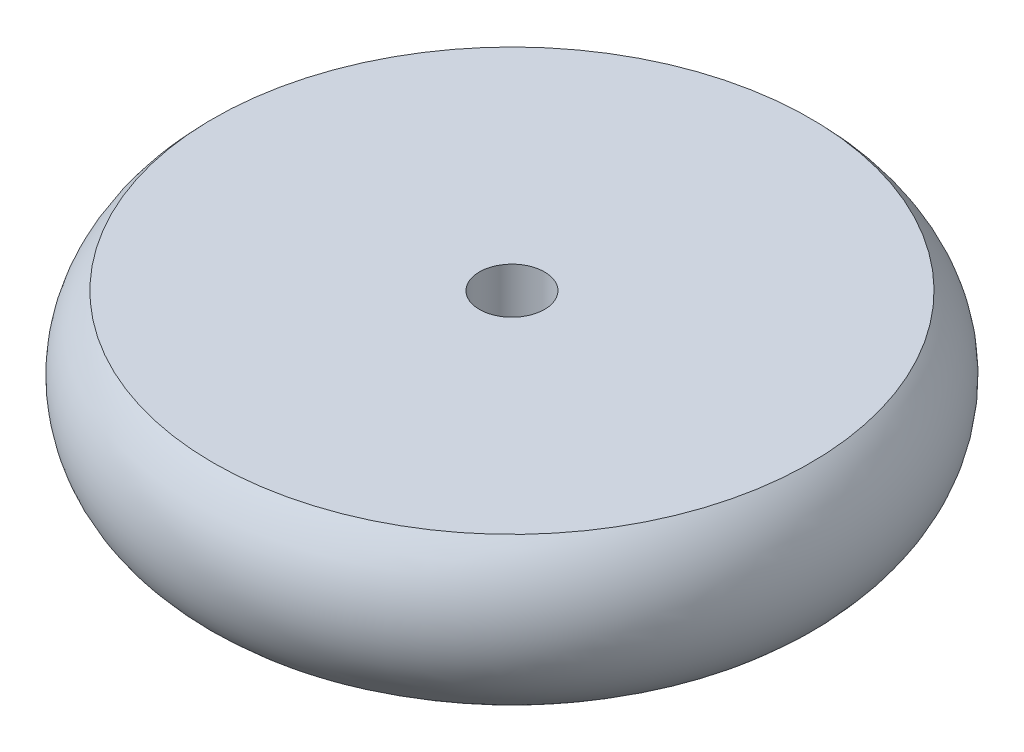
ISO-10303-21;
HEADER;
FILE_DESCRIPTION(('STEP AP214'),'2;1');
FILE_NAME('part.step','',(''),(''),'','','');
FILE_SCHEMA(('AUTOMOTIVE_DESIGN { 1 0 10303 214 1 1 1 1 }'));
ENDSEC;
DATA;
#1=APPLICATION_CONTEXT('core data for automotive mechanical design processes');
#2=APPLICATION_PROTOCOL_DEFINITION('international standard','automotive_design',2000,#1);
#3=PRODUCT_CONTEXT('',#1,'mechanical');
#4=PRODUCT('Part','Part','',(#3));
#5=PRODUCT_RELATED_PRODUCT_CATEGORY('part','',(#4));
#6=PRODUCT_DEFINITION_FORMATION('','',#4);
#7=PRODUCT_DEFINITION_CONTEXT('part definition',#1,'design');
#8=PRODUCT_DEFINITION('design','',#6,#7);
#9=PRODUCT_DEFINITION_SHAPE('','',#8);
#10=(LENGTH_UNIT() NAMED_UNIT(*) SI_UNIT(.MILLI.,.METRE.));
#11=(NAMED_UNIT(*) PLANE_ANGLE_UNIT() SI_UNIT($,.RADIAN.));
#12=(NAMED_UNIT(*) SI_UNIT($,.STERADIAN.) SOLID_ANGLE_UNIT());
#13=UNCERTAINTY_MEASURE_WITH_UNIT(LENGTH_MEASURE(1.E-05),#10,'distance_accuracy_value','');
#14=(GEOMETRIC_REPRESENTATION_CONTEXT(3) GLOBAL_UNCERTAINTY_ASSIGNED_CONTEXT((#13)) GLOBAL_UNIT_ASSIGNED_CONTEXT((#10,
#11,#12)) REPRESENTATION_CONTEXT('',''));
#15=CARTESIAN_POINT('',(0.,0.,0.));
#16=DIRECTION('',(0.,0.,1.));
#17=DIRECTION('',(1.,0.,0.));
#18=AXIS2_PLACEMENT_3D('',#15,#16,#17);
#19=CARTESIAN_POINT('',(8.06045468459707,-12.5,0.));
#20=DIRECTION('',(0.,1.,0.));
#21=DIRECTION('',(0.,0.,1.));
#22=AXIS2_PLACEMENT_3D('',#19,#20,#21);
#23=PLANE('',#22);
#24=CARTESIAN_POINT('',(0.,-12.5,0.));
#25=DIRECTION('',(0.,1.,0.));
#26=DIRECTION('',(0.,0.,1.));
#27=AXIS2_PLACEMENT_3D('',#24,#25,#26);
#28=CIRCLE('',#27,28.);
#29=CARTESIAN_POINT('',(0.,-12.5,28.));
#30=VERTEX_POINT('',#29);
#31=EDGE_CURVE('E10',#30,#30,#28,.T.);
#32=ORIENTED_EDGE('',*,*,#31,.F.);
#33=EDGE_LOOP('',(#32));
#34=FACE_BOUND('',#33,.T.);
#35=CARTESIAN_POINT('',(0.,-12.5,0.));
#36=DIRECTION('',(0.,1.,0.));
#37=DIRECTION('',(0.,0.,1.));
#38=AXIS2_PLACEMENT_3D('',#35,#36,#37);
#39=CIRCLE('',#38,4.);
#40=CARTESIAN_POINT('',(0.,-12.5,4.));
#41=VERTEX_POINT('',#40);
#42=EDGE_CURVE('E48',#41,#41,#39,.T.);
#43=ORIENTED_EDGE('',*,*,#42,.T.);
#44=EDGE_LOOP('',(#43));
#45=FACE_BOUND('',#44,.T.);
#46=ADVANCED_FACE('F34',(#34,#45),#23,.F.);
#47=CARTESIAN_POINT('',(0.,0.,0.));
#48=DIRECTION('',(0.,1.,0.));
#49=DIRECTION('',(0.,0.,1.));
#50=AXIS2_PLACEMENT_3D('',#47,#48,#49);
#51=TOROIDAL_SURFACE('',#50,28.,12.5);
#52=CARTESIAN_POINT('',(0.,8.99999999999999,0.));
#53=DIRECTION('',(0.,1.,0.));
#54=DIRECTION('',(0.,0.,1.));
#55=AXIS2_PLACEMENT_3D('',#52,#53,#54);
#56=CIRCLE('',#55,36.6746757864487);
#57=CARTESIAN_POINT('',(0.,8.99999999999999,36.6746757864487));
#58=VERTEX_POINT('',#57);
#59=EDGE_CURVE('E40',#58,#58,#56,.T.);
#60=ORIENTED_EDGE('',*,*,#59,.F.);
#61=EDGE_LOOP('',(#60));
#62=FACE_BOUND('',#61,.T.);
#63=ORIENTED_EDGE('',*,*,#31,.T.);
#64=EDGE_LOOP('',(#63));
#65=FACE_BOUND('',#64,.T.);
#66=ADVANCED_FACE('F63',(#62,#65),#51,.T.);
#67=CARTESIAN_POINT('',(8.06045468459707,8.99999999999999,0.));
#68=DIRECTION('',(0.,1.,0.));
#69=DIRECTION('',(0.,0.,1.));
#70=AXIS2_PLACEMENT_3D('',#67,#68,#69);
#71=PLANE('',#70);
#72=ORIENTED_EDGE('',*,*,#59,.T.);
#73=EDGE_LOOP('',(#72));
#74=FACE_BOUND('',#73,.T.);
#75=CARTESIAN_POINT('',(0.,8.99999999999999,0.));
#76=DIRECTION('',(0.,1.,0.));
#77=DIRECTION('',(0.,0.,1.));
#78=AXIS2_PLACEMENT_3D('',#75,#76,#77);
#79=CIRCLE('',#78,4.);
#80=CARTESIAN_POINT('',(0.,8.99999999999999,4.));
#81=VERTEX_POINT('',#80);
#82=EDGE_CURVE('E44',#81,#81,#79,.T.);
#83=ORIENTED_EDGE('',*,*,#82,.F.);
#84=EDGE_LOOP('',(#83));
#85=FACE_BOUND('',#84,.T.);
#86=ADVANCED_FACE('F58',(#74,#85),#71,.T.);
#87=CARTESIAN_POINT('',(0.,26.2366926963357,0.));
#88=DIRECTION('',(0.,1.,0.));
#89=DIRECTION('',(0.,0.,1.));
#90=AXIS2_PLACEMENT_3D('',#87,#88,#89);
#91=CYLINDRICAL_SURFACE('',#90,4.);
#92=ORIENTED_EDGE('',*,*,#42,.F.);
#93=EDGE_LOOP('',(#92));
#94=FACE_BOUND('',#93,.T.);
#95=ORIENTED_EDGE('',*,*,#82,.T.);
#96=EDGE_LOOP('',(#95));
#97=FACE_BOUND('',#96,.T.);
#98=ADVANCED_FACE('F55',(#94,#97),#91,.F.);
#99=CLOSED_SHELL('',(#46,#66,#86,#98));
#100=MANIFOLD_SOLID_BREP('B2',#99);
#101=ADVANCED_BREP_SHAPE_REPRESENTATION('',(#18,#100),#14);
#102=SHAPE_DEFINITION_REPRESENTATION(#9,#101);
ENDSEC;
END-ISO-10303-21;
